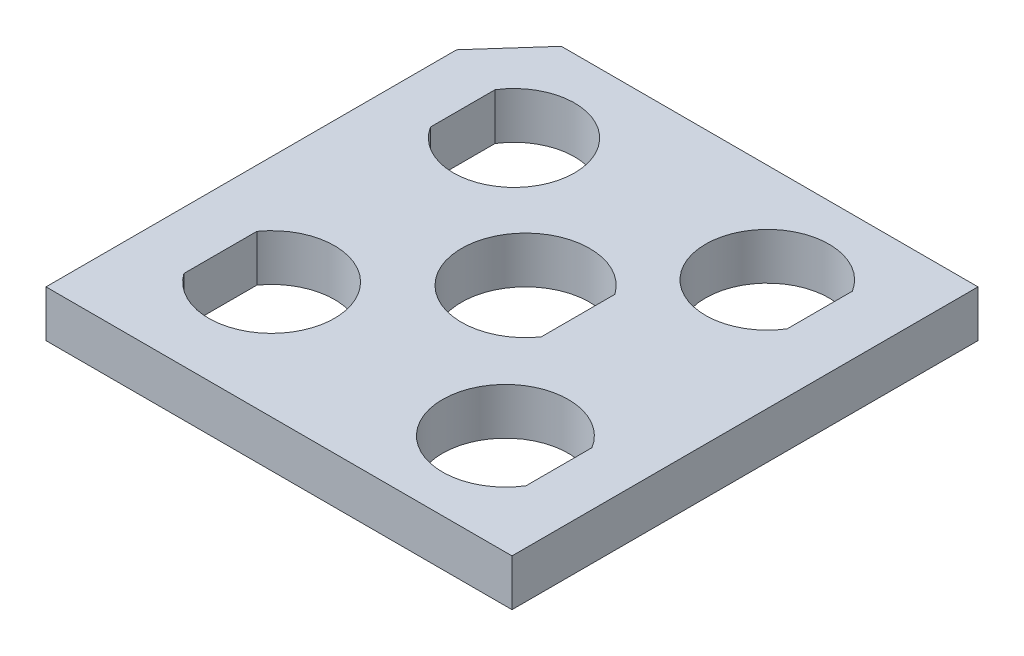
ISO-10303-21;
HEADER;
FILE_DESCRIPTION(('STEP AP214'),'2;1');
FILE_NAME('part.step','',(''),(''),'','','');
FILE_SCHEMA(('AUTOMOTIVE_DESIGN { 1 0 10303 214 1 1 1 1 }'));
ENDSEC;
DATA;
#1=APPLICATION_CONTEXT('core data for automotive mechanical design processes');
#2=APPLICATION_PROTOCOL_DEFINITION('international standard','automotive_design',2000,#1);
#3=PRODUCT_CONTEXT('',#1,'mechanical');
#4=PRODUCT('Part','Part','',(#3));
#5=PRODUCT_RELATED_PRODUCT_CATEGORY('part','',(#4));
#6=PRODUCT_DEFINITION_FORMATION('','',#4);
#7=PRODUCT_DEFINITION_CONTEXT('part definition',#1,'design');
#8=PRODUCT_DEFINITION('design','',#6,#7);
#9=PRODUCT_DEFINITION_SHAPE('','',#8);
#10=(LENGTH_UNIT() NAMED_UNIT(*) SI_UNIT(.MILLI.,.METRE.));
#11=(NAMED_UNIT(*) PLANE_ANGLE_UNIT() SI_UNIT($,.RADIAN.));
#12=(NAMED_UNIT(*) SI_UNIT($,.STERADIAN.) SOLID_ANGLE_UNIT());
#13=UNCERTAINTY_MEASURE_WITH_UNIT(LENGTH_MEASURE(1.E-05),#10,'distance_accuracy_value','');
#14=(GEOMETRIC_REPRESENTATION_CONTEXT(3) GLOBAL_UNCERTAINTY_ASSIGNED_CONTEXT((#13)) GLOBAL_UNIT_ASSIGNED_CONTEXT((#10,
#11,#12)) REPRESENTATION_CONTEXT('',''));
#15=CARTESIAN_POINT('',(0.,0.,0.));
#16=DIRECTION('',(0.,0.,1.));
#17=DIRECTION('',(1.,0.,0.));
#18=AXIS2_PLACEMENT_3D('',#15,#16,#17);
#19=CARTESIAN_POINT('',(0.,2.,0.));
#20=DIRECTION('',(0.,0.,-1.));
#21=DIRECTION('',(-1.,0.,0.));
#22=AXIS2_PLACEMENT_3D('',#19,#20,#21);
#23=PLANE('',#22);
#24=DIRECTION('',(1.,0.,0.));
#25=VECTOR('',#24,1.);
#26=CARTESIAN_POINT('',(0.,0.,0.));
#27=LINE('',#26,#25);
#28=CARTESIAN_POINT('',(0.,0.,0.));
#29=VERTEX_POINT('',#28);
#30=CARTESIAN_POINT('',(20.,0.,0.));
#31=VERTEX_POINT('',#30);
#32=EDGE_CURVE('E269',#29,#31,#27,.T.);
#33=ORIENTED_EDGE('',*,*,#32,.T.);
#34=DIRECTION('',(0.,-1.,0.));
#35=VECTOR('',#34,1.);
#36=CARTESIAN_POINT('',(20.,2.,0.));
#37=LINE('',#36,#35);
#38=CARTESIAN_POINT('',(20.,2.,0.));
#39=VERTEX_POINT('',#38);
#40=EDGE_CURVE('E51',#39,#31,#37,.T.);
#41=ORIENTED_EDGE('',*,*,#40,.F.);
#42=DIRECTION('',(1.,0.,0.));
#43=VECTOR('',#42,1.);
#44=CARTESIAN_POINT('',(0.,2.,0.));
#45=LINE('',#44,#43);
#46=CARTESIAN_POINT('',(0.,2.,0.));
#47=VERTEX_POINT('',#46);
#48=EDGE_CURVE('E270',#47,#39,#45,.T.);
#49=ORIENTED_EDGE('',*,*,#48,.F.);
#50=DIRECTION('',(0.,-1.,0.));
#51=VECTOR('',#50,1.);
#52=CARTESIAN_POINT('',(0.,2.,0.));
#53=LINE('',#52,#51);
#54=EDGE_CURVE('E285',#47,#29,#53,.T.);
#55=ORIENTED_EDGE('',*,*,#54,.T.);
#56=EDGE_LOOP('',(#33,#41,#49,#55));
#57=FACE_BOUND('',#56,.T.);
#58=ADVANCED_FACE('F43',(#57),#23,.F.);
#59=CARTESIAN_POINT('',(20.,2.,-20.));
#60=DIRECTION('',(-1.,0.,0.));
#61=DIRECTION('',(0.,0.,1.));
#62=AXIS2_PLACEMENT_3D('',#59,#60,#61);
#63=PLANE('',#62);
#64=DIRECTION('',(0.,0.,-1.));
#65=VECTOR('',#64,1.);
#66=CARTESIAN_POINT('',(20.,0.,-20.));
#67=LINE('',#66,#65);
#68=CARTESIAN_POINT('',(20.,0.,-20.));
#69=VERTEX_POINT('',#68);
#70=EDGE_CURVE('E289',#31,#69,#67,.T.);
#71=ORIENTED_EDGE('',*,*,#70,.T.);
#72=DIRECTION('',(0.,-1.,0.));
#73=VECTOR('',#72,1.);
#74=CARTESIAN_POINT('',(20.,2.,-20.));
#75=LINE('',#74,#73);
#76=CARTESIAN_POINT('',(20.,2.,-20.));
#77=VERTEX_POINT('',#76);
#78=EDGE_CURVE('E301',#77,#69,#75,.T.);
#79=ORIENTED_EDGE('',*,*,#78,.F.);
#80=DIRECTION('',(0.,0.,-1.));
#81=VECTOR('',#80,1.);
#82=CARTESIAN_POINT('',(20.,2.,-20.));
#83=LINE('',#82,#81);
#84=EDGE_CURVE('E274',#39,#77,#83,.T.);
#85=ORIENTED_EDGE('',*,*,#84,.F.);
#86=ORIENTED_EDGE('',*,*,#40,.T.);
#87=EDGE_LOOP('',(#71,#79,#85,#86));
#88=FACE_BOUND('',#87,.T.);
#89=ADVANCED_FACE('F308',(#88),#63,.F.);
#90=CARTESIAN_POINT('',(0.,2.,-20.));
#91=DIRECTION('',(0.,0.,1.));
#92=DIRECTION('',(1.,0.,0.));
#93=AXIS2_PLACEMENT_3D('',#90,#91,#92);
#94=PLANE('',#93);
#95=DIRECTION('',(-1.,0.,0.));
#96=VECTOR('',#95,1.);
#97=CARTESIAN_POINT('',(0.,0.,-20.));
#98=LINE('',#97,#96);
#99=CARTESIAN_POINT('',(2.11819946619171,0.,-20.));
#100=VERTEX_POINT('',#99);
#101=EDGE_CURVE('E292',#69,#100,#98,.T.);
#102=ORIENTED_EDGE('',*,*,#101,.T.);
#103=DIRECTION('',(0.,1.,0.));
#104=VECTOR('',#103,1.);
#105=CARTESIAN_POINT('',(2.1181994661917,2.,-20.));
#106=LINE('',#105,#104);
#107=CARTESIAN_POINT('',(2.1181994661917,2.,-20.));
#108=VERTEX_POINT('',#107);
#109=EDGE_CURVE('E265',#100,#108,#106,.T.);
#110=ORIENTED_EDGE('',*,*,#109,.T.);
#111=DIRECTION('',(-1.,0.,0.));
#112=VECTOR('',#111,1.);
#113=CARTESIAN_POINT('',(0.,2.,-20.));
#114=LINE('',#113,#112);
#115=EDGE_CURVE('E278',#77,#108,#114,.T.);
#116=ORIENTED_EDGE('',*,*,#115,.F.);
#117=ORIENTED_EDGE('',*,*,#78,.T.);
#118=EDGE_LOOP('',(#102,#110,#116,#117));
#119=FACE_BOUND('',#118,.T.);
#120=ADVANCED_FACE('F321',(#119),#94,.F.);
#121=CARTESIAN_POINT('',(0.,2.,0.));
#122=DIRECTION('',(1.,0.,0.));
#123=DIRECTION('',(0.,0.,-1.));
#124=AXIS2_PLACEMENT_3D('',#121,#122,#123);
#125=PLANE('',#124);
#126=DIRECTION('',(0.,0.,1.));
#127=VECTOR('',#126,1.);
#128=CARTESIAN_POINT('',(0.,2.,0.));
#129=LINE('',#128,#127);
#130=CARTESIAN_POINT('',(0.,2.,-17.6223947860638));
#131=VERTEX_POINT('',#130);
#132=EDGE_CURVE('E282',#131,#47,#129,.T.);
#133=ORIENTED_EDGE('',*,*,#132,.F.);
#134=DIRECTION('',(0.,-1.,0.));
#135=VECTOR('',#134,1.);
#136=CARTESIAN_POINT('',(0.,2.,-17.6223947860638));
#137=LINE('',#136,#135);
#138=CARTESIAN_POINT('',(0.,0.,-17.6223947860638));
#139=VERTEX_POINT('',#138);
#140=EDGE_CURVE('E258',#131,#139,#137,.T.);
#141=ORIENTED_EDGE('',*,*,#140,.T.);
#142=DIRECTION('',(0.,0.,1.));
#143=VECTOR('',#142,1.);
#144=CARTESIAN_POINT('',(0.,0.,0.));
#145=LINE('',#144,#143);
#146=EDGE_CURVE('E275',#139,#29,#145,.T.);
#147=ORIENTED_EDGE('',*,*,#146,.T.);
#148=ORIENTED_EDGE('',*,*,#54,.F.);
#149=EDGE_LOOP('',(#133,#141,#147,#148));
#150=FACE_BOUND('',#149,.T.);
#151=ADVANCED_FACE('F327',(#150),#125,.F.);
#152=CARTESIAN_POINT('',(0.,2.,0.));
#153=DIRECTION('',(0.,-1.,0.));
#154=DIRECTION('',(0.,0.,-1.));
#155=AXIS2_PLACEMENT_3D('',#152,#153,#154);
#156=PLANE('',#155);
#157=DIRECTION('',(0.,0.,-1.));
#158=VECTOR('',#157,1.);
#159=CARTESIAN_POINT('',(12.4861029370701,2.,-11.9279963013426));
#160=LINE('',#159,#158);
#161=CARTESIAN_POINT('',(12.4861029370701,2.,-8.76571864117421));
#162=VERTEX_POINT('',#161);
#163=CARTESIAN_POINT('',(12.4861029370701,2.,-11.9279963013426));
#164=VERTEX_POINT('',#163);
#165=EDGE_CURVE('E186',#162,#164,#160,.T.);
#166=ORIENTED_EDGE('',*,*,#165,.F.);
#167=CARTESIAN_POINT('',(10.2361029370701,2.,-10.3468574712584));
#168=DIRECTION('',(0.,1.,0.));
#169=DIRECTION('',(0.,0.,1.));
#170=AXIS2_PLACEMENT_3D('',#167,#168,#169);
#171=CIRCLE('',#170,2.75);
#172=EDGE_CURVE('E58',#164,#162,#171,.T.);
#173=ORIENTED_EDGE('',*,*,#172,.F.);
#174=EDGE_LOOP('',(#166,#173));
#175=FACE_BOUND('',#174,.T.);
#176=DIRECTION('',(0.,0.,1.));
#177=VECTOR('',#176,1.);
#178=CARTESIAN_POINT('',(2.46166722090004,2.,-3.45597393724215));
#179=LINE('',#178,#177);
#180=CARTESIAN_POINT('',(2.46166722090004,2.,-6.58646910574189));
#181=VERTEX_POINT('',#180);
#182=CARTESIAN_POINT('',(2.46166722090004,2.,-3.45597393724215));
#183=VERTEX_POINT('',#182);
#184=EDGE_CURVE('E159',#181,#183,#179,.T.);
#185=ORIENTED_EDGE('',*,*,#184,.F.);
#186=CARTESIAN_POINT('',(4.66166722090002,2.,-5.02122152149202));
#187=DIRECTION('',(0.,1.,0.));
#188=DIRECTION('',(0.,0.,1.));
#189=AXIS2_PLACEMENT_3D('',#186,#187,#188);
#190=CIRCLE('',#189,2.7);
#191=EDGE_CURVE('E66',#183,#181,#190,.T.);
#192=ORIENTED_EDGE('',*,*,#191,.F.);
#193=EDGE_LOOP('',(#185,#192));
#194=FACE_BOUND('',#193,.T.);
#195=DIRECTION('',(0.,0.,1.));
#196=VECTOR('',#195,1.);
#197=CARTESIAN_POINT('',(2.30929495883291,2.,-16.9626943989844));
#198=LINE('',#197,#196);
#199=CARTESIAN_POINT('',(2.30929495883291,2.,-16.9626943989844));
#200=VERTEX_POINT('',#199);
#201=CARTESIAN_POINT('',(2.30929495883291,2.,-14.1914131068742));
#202=VERTEX_POINT('',#201);
#203=EDGE_CURVE('E227',#200,#202,#198,.T.);
#204=ORIENTED_EDGE('',*,*,#203,.F.);
#205=CARTESIAN_POINT('',(4.5092949588329,2.,-15.5770537529293));
#206=DIRECTION('',(0.,1.,0.));
#207=DIRECTION('',(0.,0.,1.));
#208=AXIS2_PLACEMENT_3D('',#205,#206,#207);
#209=CIRCLE('',#208,2.6);
#210=EDGE_CURVE('E207',#202,#200,#209,.T.);
#211=ORIENTED_EDGE('',*,*,#210,.F.);
#212=EDGE_LOOP('',(#204,#211));
#213=FACE_BOUND('',#212,.T.);
#214=DIRECTION('',(0.,0.,-1.));
#215=VECTOR('',#214,1.);
#216=CARTESIAN_POINT('',(17.693873019264,2.,-5.73826861285755));
#217=LINE('',#216,#215);
#218=CARTESIAN_POINT('',(17.693873019264,2.,-2.90984148811137));
#219=VERTEX_POINT('',#218);
#220=CARTESIAN_POINT('',(17.693873019264,2.,-5.73826861285755));
#221=VERTEX_POINT('',#220);
#222=EDGE_CURVE('E208',#219,#221,#217,.T.);
#223=ORIENTED_EDGE('',*,*,#222,.F.);
#224=CARTESIAN_POINT('',(15.393873019264,2.,-4.32405505048446));
#225=DIRECTION('',(0.,1.,0.));
#226=DIRECTION('',(0.,0.,1.));
#227=AXIS2_PLACEMENT_3D('',#224,#225,#226);
#228=CIRCLE('',#227,2.7);
#229=EDGE_CURVE('E212',#221,#219,#228,.T.);
#230=ORIENTED_EDGE('',*,*,#229,.F.);
#231=EDGE_LOOP('',(#223,#230));
#232=FACE_BOUND('',#231,.T.);
#233=DIRECTION('',(0.,0.,-1.));
#234=VECTOR('',#233,1.);
#235=CARTESIAN_POINT('',(17.4651382805834,2.,-14.3413794068401));
#236=LINE('',#235,#234);
#237=CARTESIAN_POINT('',(17.4651382805834,2.,-14.3413794068401));
#238=VERTEX_POINT('',#237);
#239=CARTESIAN_POINT('',(17.4651382805834,2.,-17.1413794068401));
#240=VERTEX_POINT('',#239);
#241=EDGE_CURVE('E245',#238,#240,#236,.T.);
#242=ORIENTED_EDGE('',*,*,#241,.F.);
#243=CARTESIAN_POINT('',(15.2151382805834,2.,-15.7413794068401));
#244=DIRECTION('',(0.,1.,0.));
#245=DIRECTION('',(0.,0.,1.));
#246=AXIS2_PLACEMENT_3D('',#243,#244,#245);
#247=CIRCLE('',#246,2.65000000000004);
#248=EDGE_CURVE('E216',#240,#238,#247,.T.);
#249=ORIENTED_EDGE('',*,*,#248,.F.);
#250=EDGE_LOOP('',(#242,#249));
#251=FACE_BOUND('',#250,.T.);
#252=ORIENTED_EDGE('',*,*,#115,.T.);
#253=DIRECTION('',(0.665200678881918,0.,-0.746664621376315));
#254=VECTOR('',#253,1.);
#255=CARTESIAN_POINT('',(3.12502159185943,2.,-21.1301228112373));
#256=LINE('',#255,#254);
#257=EDGE_CURVE('E185',#131,#108,#256,.T.);
#258=ORIENTED_EDGE('',*,*,#257,.F.);
#259=ORIENTED_EDGE('',*,*,#132,.T.);
#260=ORIENTED_EDGE('',*,*,#48,.T.);
#261=ORIENTED_EDGE('',*,*,#84,.T.);
#262=EDGE_LOOP('',(#252,#258,#259,#260,#261));
#263=FACE_BOUND('',#262,.T.);
#264=ADVANCED_FACE('F164',(#175,#194,#213,#232,#251,#263),#156,.F.);
#265=CARTESIAN_POINT('',(0.,0.,0.));
#266=DIRECTION('',(0.,-1.,0.));
#267=DIRECTION('',(0.,0.,-1.));
#268=AXIS2_PLACEMENT_3D('',#265,#266,#267);
#269=PLANE('',#268);
#270=CARTESIAN_POINT('',(10.2361029370701,0.,-10.3468574712584));
#271=DIRECTION('',(0.,1.,0.));
#272=DIRECTION('',(0.,0.,1.));
#273=AXIS2_PLACEMENT_3D('',#270,#271,#272);
#274=CIRCLE('',#273,2.75);
#275=CARTESIAN_POINT('',(12.4861029370701,0.,-11.9279963013426));
#276=VERTEX_POINT('',#275);
#277=CARTESIAN_POINT('',(12.4861029370701,0.,-8.76571864117421));
#278=VERTEX_POINT('',#277);
#279=EDGE_CURVE('E190',#276,#278,#274,.T.);
#280=ORIENTED_EDGE('',*,*,#279,.T.);
#281=DIRECTION('',(0.,0.,-1.));
#282=VECTOR('',#281,1.);
#283=CARTESIAN_POINT('',(12.4861029370701,0.,-11.9279963013426));
#284=LINE('',#283,#282);
#285=EDGE_CURVE('E181',#278,#276,#284,.T.);
#286=ORIENTED_EDGE('',*,*,#285,.T.);
#287=EDGE_LOOP('',(#280,#286));
#288=FACE_BOUND('',#287,.T.);
#289=CARTESIAN_POINT('',(4.66166722090002,0.,-5.02122152149202));
#290=DIRECTION('',(0.,1.,0.));
#291=DIRECTION('',(0.,0.,1.));
#292=AXIS2_PLACEMENT_3D('',#289,#290,#291);
#293=CIRCLE('',#292,2.7);
#294=CARTESIAN_POINT('',(2.46166722090004,0.,-3.45597393724215));
#295=VERTEX_POINT('',#294);
#296=CARTESIAN_POINT('',(2.46166722090004,0.,-6.58646910574189));
#297=VERTEX_POINT('',#296);
#298=EDGE_CURVE('E151',#295,#297,#293,.T.);
#299=ORIENTED_EDGE('',*,*,#298,.T.);
#300=DIRECTION('',(0.,0.,1.));
#301=VECTOR('',#300,1.);
#302=CARTESIAN_POINT('',(2.46166722090004,0.,-3.45597393724215));
#303=LINE('',#302,#301);
#304=EDGE_CURVE('E173',#297,#295,#303,.T.);
#305=ORIENTED_EDGE('',*,*,#304,.T.);
#306=EDGE_LOOP('',(#299,#305));
#307=FACE_BOUND('',#306,.T.);
#308=CARTESIAN_POINT('',(4.5092949588329,0.,-15.5770537529293));
#309=DIRECTION('',(0.,1.,0.));
#310=DIRECTION('',(0.,0.,1.));
#311=AXIS2_PLACEMENT_3D('',#308,#309,#310);
#312=CIRCLE('',#311,2.6);
#313=CARTESIAN_POINT('',(2.30929495883291,0.,-14.1914131068742));
#314=VERTEX_POINT('',#313);
#315=CARTESIAN_POINT('',(2.30929495883291,0.,-16.9626943989844));
#316=VERTEX_POINT('',#315);
#317=EDGE_CURVE('E231',#314,#316,#312,.T.);
#318=ORIENTED_EDGE('',*,*,#317,.T.);
#319=DIRECTION('',(0.,0.,1.));
#320=VECTOR('',#319,1.);
#321=CARTESIAN_POINT('',(2.30929495883291,0.,-16.9626943989844));
#322=LINE('',#321,#320);
#323=EDGE_CURVE('E225',#316,#314,#322,.T.);
#324=ORIENTED_EDGE('',*,*,#323,.T.);
#325=EDGE_LOOP('',(#318,#324));
#326=FACE_BOUND('',#325,.T.);
#327=CARTESIAN_POINT('',(15.393873019264,0.,-4.32405505048446));
#328=DIRECTION('',(0.,1.,0.));
#329=DIRECTION('',(0.,0.,1.));
#330=AXIS2_PLACEMENT_3D('',#327,#328,#329);
#331=CIRCLE('',#330,2.7);
#332=CARTESIAN_POINT('',(17.693873019264,0.,-5.73826861285755));
#333=VERTEX_POINT('',#332);
#334=CARTESIAN_POINT('',(17.693873019264,0.,-2.90984148811137));
#335=VERTEX_POINT('',#334);
#336=EDGE_CURVE('E213',#333,#335,#331,.T.);
#337=ORIENTED_EDGE('',*,*,#336,.T.);
#338=DIRECTION('',(0.,0.,-1.));
#339=VECTOR('',#338,1.);
#340=CARTESIAN_POINT('',(17.693873019264,0.,-5.73826861285755));
#341=LINE('',#340,#339);
#342=EDGE_CURVE('E203',#335,#333,#341,.T.);
#343=ORIENTED_EDGE('',*,*,#342,.T.);
#344=EDGE_LOOP('',(#337,#343));
#345=FACE_BOUND('',#344,.T.);
#346=DIRECTION('',(-0.665200678881918,0.,0.746664621376315));
#347=VECTOR('',#346,1.);
#348=CARTESIAN_POINT('',(-8.75272299238952,0.,-7.79776771245797));
#349=LINE('',#348,#347);
#350=EDGE_CURVE('E11',#100,#139,#349,.T.);
#351=ORIENTED_EDGE('',*,*,#350,.F.);
#352=ORIENTED_EDGE('',*,*,#101,.F.);
#353=ORIENTED_EDGE('',*,*,#70,.F.);
#354=ORIENTED_EDGE('',*,*,#32,.F.);
#355=ORIENTED_EDGE('',*,*,#146,.F.);
#356=EDGE_LOOP('',(#351,#352,#353,#354,#355));
#357=FACE_BOUND('',#356,.T.);
#358=CARTESIAN_POINT('',(15.2151382805834,0.,-15.7413794068401));
#359=DIRECTION('',(0.,1.,0.));
#360=DIRECTION('',(0.,0.,1.));
#361=AXIS2_PLACEMENT_3D('',#358,#359,#360);
#362=CIRCLE('',#361,2.65000000000004);
#363=CARTESIAN_POINT('',(17.4651382805834,0.,-17.1413794068401));
#364=VERTEX_POINT('',#363);
#365=CARTESIAN_POINT('',(17.4651382805834,0.,-14.3413794068401));
#366=VERTEX_POINT('',#365);
#367=EDGE_CURVE('E240',#364,#366,#362,.T.);
#368=ORIENTED_EDGE('',*,*,#367,.T.);
#369=DIRECTION('',(0.,0.,-1.));
#370=VECTOR('',#369,1.);
#371=CARTESIAN_POINT('',(17.4651382805834,0.,-14.3413794068401));
#372=LINE('',#371,#370);
#373=EDGE_CURVE('E244',#366,#364,#372,.T.);
#374=ORIENTED_EDGE('',*,*,#373,.T.);
#375=EDGE_LOOP('',(#368,#374));
#376=FACE_BOUND('',#375,.T.);
#377=ADVANCED_FACE('F317',(#288,#307,#326,#345,#357,#376),#269,.T.);
#378=CARTESIAN_POINT('',(15.2151382805834,0.,-15.7413794068401));
#379=DIRECTION('',(0.,1.,0.));
#380=DIRECTION('',(0.,0.,1.));
#381=AXIS2_PLACEMENT_3D('',#378,#379,#380);
#382=CYLINDRICAL_SURFACE('',#381,2.65000000000004);
#383=ORIENTED_EDGE('',*,*,#248,.T.);
#384=DIRECTION('',(0.,1.,0.));
#385=VECTOR('',#384,1.);
#386=CARTESIAN_POINT('',(17.4651382805834,0.,-14.3413794068401));
#387=LINE('',#386,#385);
#388=EDGE_CURVE('E249',#366,#238,#387,.T.);
#389=ORIENTED_EDGE('',*,*,#388,.F.);
#390=ORIENTED_EDGE('',*,*,#367,.F.);
#391=DIRECTION('',(0.,1.,0.));
#392=VECTOR('',#391,1.);
#393=CARTESIAN_POINT('',(17.4651382805834,0.,-17.1413794068401));
#394=LINE('',#393,#392);
#395=EDGE_CURVE('E255',#364,#240,#394,.T.);
#396=ORIENTED_EDGE('',*,*,#395,.T.);
#397=EDGE_LOOP('',(#383,#389,#390,#396));
#398=FACE_BOUND('',#397,.T.);
#399=ADVANCED_FACE('F345',(#398),#382,.F.);
#400=CARTESIAN_POINT('',(17.4651382805834,0.,-14.3413794068401));
#401=DIRECTION('',(1.,0.,0.));
#402=DIRECTION('',(0.,0.,-1.));
#403=AXIS2_PLACEMENT_3D('',#400,#401,#402);
#404=PLANE('',#403);
#405=ORIENTED_EDGE('',*,*,#241,.T.);
#406=ORIENTED_EDGE('',*,*,#395,.F.);
#407=ORIENTED_EDGE('',*,*,#373,.F.);
#408=ORIENTED_EDGE('',*,*,#388,.T.);
#409=EDGE_LOOP('',(#405,#406,#407,#408));
#410=FACE_BOUND('',#409,.T.);
#411=ADVANCED_FACE('F336',(#410),#404,.F.);
#412=CARTESIAN_POINT('',(3.12502159185943,0.,-21.1301228112373));
#413=DIRECTION('',(0.746664621376315,0.,0.665200678881918));
#414=DIRECTION('',(0.665200678881918,0.,-0.746664621376315));
#415=AXIS2_PLACEMENT_3D('',#412,#413,#414);
#416=PLANE('',#415);
#417=ORIENTED_EDGE('',*,*,#350,.T.);
#418=ORIENTED_EDGE('',*,*,#140,.F.);
#419=ORIENTED_EDGE('',*,*,#257,.T.);
#420=ORIENTED_EDGE('',*,*,#109,.F.);
#421=EDGE_LOOP('',(#417,#418,#419,#420));
#422=FACE_BOUND('',#421,.T.);
#423=ADVANCED_FACE('F329',(#422),#416,.F.);
#424=CARTESIAN_POINT('',(15.393873019264,0.,-4.32405505048446));
#425=DIRECTION('',(0.,1.,0.));
#426=DIRECTION('',(0.,0.,1.));
#427=AXIS2_PLACEMENT_3D('',#424,#425,#426);
#428=CYLINDRICAL_SURFACE('',#427,2.7);
#429=ORIENTED_EDGE('',*,*,#229,.T.);
#430=DIRECTION('',(0.,1.,0.));
#431=VECTOR('',#430,1.);
#432=CARTESIAN_POINT('',(17.693873019264,0.,-2.90984148811137));
#433=LINE('',#432,#431);
#434=EDGE_CURVE('E199',#335,#219,#433,.T.);
#435=ORIENTED_EDGE('',*,*,#434,.F.);
#436=ORIENTED_EDGE('',*,*,#336,.F.);
#437=DIRECTION('',(0.,1.,0.));
#438=VECTOR('',#437,1.);
#439=CARTESIAN_POINT('',(17.693873019264,0.,-5.73826861285755));
#440=LINE('',#439,#438);
#441=EDGE_CURVE('E204',#333,#221,#440,.T.);
#442=ORIENTED_EDGE('',*,*,#441,.T.);
#443=EDGE_LOOP('',(#429,#435,#436,#442));
#444=FACE_BOUND('',#443,.T.);
#445=ADVANCED_FACE('F335',(#444),#428,.F.);
#446=CARTESIAN_POINT('',(17.693873019264,0.,-5.73826861285755));
#447=DIRECTION('',(1.,0.,0.));
#448=DIRECTION('',(0.,0.,-1.));
#449=AXIS2_PLACEMENT_3D('',#446,#447,#448);
#450=PLANE('',#449);
#451=ORIENTED_EDGE('',*,*,#222,.T.);
#452=ORIENTED_EDGE('',*,*,#441,.F.);
#453=ORIENTED_EDGE('',*,*,#342,.F.);
#454=ORIENTED_EDGE('',*,*,#434,.T.);
#455=EDGE_LOOP('',(#451,#452,#453,#454));
#456=FACE_BOUND('',#455,.T.);
#457=ADVANCED_FACE('F342',(#456),#450,.F.);
#458=CARTESIAN_POINT('',(4.5092949588329,0.,-15.5770537529293));
#459=DIRECTION('',(0.,1.,0.));
#460=DIRECTION('',(0.,0.,1.));
#461=AXIS2_PLACEMENT_3D('',#458,#459,#460);
#462=CYLINDRICAL_SURFACE('',#461,2.6);
#463=ORIENTED_EDGE('',*,*,#210,.T.);
#464=DIRECTION('',(0.,1.,0.));
#465=VECTOR('',#464,1.);
#466=CARTESIAN_POINT('',(2.30929495883291,0.,-16.9626943989844));
#467=LINE('',#466,#465);
#468=EDGE_CURVE('E170',#316,#200,#467,.T.);
#469=ORIENTED_EDGE('',*,*,#468,.F.);
#470=ORIENTED_EDGE('',*,*,#317,.F.);
#471=DIRECTION('',(0.,1.,0.));
#472=VECTOR('',#471,1.);
#473=CARTESIAN_POINT('',(2.30929495883291,0.,-14.1914131068742));
#474=LINE('',#473,#472);
#475=EDGE_CURVE('E167',#314,#202,#474,.T.);
#476=ORIENTED_EDGE('',*,*,#475,.T.);
#477=EDGE_LOOP('',(#463,#469,#470,#476));
#478=FACE_BOUND('',#477,.T.);
#479=ADVANCED_FACE('F372',(#478),#462,.F.);
#480=CARTESIAN_POINT('',(2.30929495883291,0.,-16.9626943989844));
#481=DIRECTION('',(-1.,0.,0.));
#482=DIRECTION('',(0.,0.,1.));
#483=AXIS2_PLACEMENT_3D('',#480,#481,#482);
#484=PLANE('',#483);
#485=ORIENTED_EDGE('',*,*,#203,.T.);
#486=ORIENTED_EDGE('',*,*,#475,.F.);
#487=ORIENTED_EDGE('',*,*,#323,.F.);
#488=ORIENTED_EDGE('',*,*,#468,.T.);
#489=EDGE_LOOP('',(#485,#486,#487,#488));
#490=FACE_BOUND('',#489,.T.);
#491=ADVANCED_FACE('F369',(#490),#484,.F.);
#492=CARTESIAN_POINT('',(4.66166722090002,0.,-5.02122152149202));
#493=DIRECTION('',(0.,1.,0.));
#494=DIRECTION('',(0.,0.,1.));
#495=AXIS2_PLACEMENT_3D('',#492,#493,#494);
#496=CYLINDRICAL_SURFACE('',#495,2.7);
#497=ORIENTED_EDGE('',*,*,#191,.T.);
#498=DIRECTION('',(0.,1.,0.));
#499=VECTOR('',#498,1.);
#500=CARTESIAN_POINT('',(2.46166722090004,0.,-6.58646910574189));
#501=LINE('',#500,#499);
#502=EDGE_CURVE('E156',#297,#181,#501,.T.);
#503=ORIENTED_EDGE('',*,*,#502,.F.);
#504=ORIENTED_EDGE('',*,*,#298,.F.);
#505=DIRECTION('',(0.,1.,0.));
#506=VECTOR('',#505,1.);
#507=CARTESIAN_POINT('',(2.46166722090004,0.,-3.45597393724215));
#508=LINE('',#507,#506);
#509=EDGE_CURVE('E147',#295,#183,#508,.T.);
#510=ORIENTED_EDGE('',*,*,#509,.T.);
#511=EDGE_LOOP('',(#497,#503,#504,#510));
#512=FACE_BOUND('',#511,.T.);
#513=ADVANCED_FACE('F149',(#512),#496,.F.);
#514=CARTESIAN_POINT('',(2.46166722090004,0.,-3.45597393724215));
#515=DIRECTION('',(-1.,0.,0.));
#516=DIRECTION('',(0.,0.,1.));
#517=AXIS2_PLACEMENT_3D('',#514,#515,#516);
#518=PLANE('',#517);
#519=ORIENTED_EDGE('',*,*,#184,.T.);
#520=ORIENTED_EDGE('',*,*,#509,.F.);
#521=ORIENTED_EDGE('',*,*,#304,.F.);
#522=ORIENTED_EDGE('',*,*,#502,.T.);
#523=EDGE_LOOP('',(#519,#520,#521,#522));
#524=FACE_BOUND('',#523,.T.);
#525=ADVANCED_FACE('F160',(#524),#518,.F.);
#526=CARTESIAN_POINT('',(10.2361029370701,0.,-10.3468574712584));
#527=DIRECTION('',(0.,1.,0.));
#528=DIRECTION('',(0.,0.,1.));
#529=AXIS2_PLACEMENT_3D('',#526,#527,#528);
#530=CYLINDRICAL_SURFACE('',#529,2.75);
#531=ORIENTED_EDGE('',*,*,#172,.T.);
#532=DIRECTION('',(0.,1.,0.));
#533=VECTOR('',#532,1.);
#534=CARTESIAN_POINT('',(12.4861029370701,0.,-8.76571864117421));
#535=LINE('',#534,#533);
#536=EDGE_CURVE('E178',#278,#162,#535,.T.);
#537=ORIENTED_EDGE('',*,*,#536,.F.);
#538=ORIENTED_EDGE('',*,*,#279,.F.);
#539=DIRECTION('',(0.,1.,0.));
#540=VECTOR('',#539,1.);
#541=CARTESIAN_POINT('',(12.4861029370701,0.,-11.9279963013426));
#542=LINE('',#541,#540);
#543=EDGE_CURVE('E182',#276,#164,#542,.T.);
#544=ORIENTED_EDGE('',*,*,#543,.T.);
#545=EDGE_LOOP('',(#531,#537,#538,#544));
#546=FACE_BOUND('',#545,.T.);
#547=ADVANCED_FACE('F383',(#546),#530,.F.);
#548=CARTESIAN_POINT('',(12.4861029370701,0.,-11.9279963013426));
#549=DIRECTION('',(1.,0.,0.));
#550=DIRECTION('',(0.,0.,-1.));
#551=AXIS2_PLACEMENT_3D('',#548,#549,#550);
#552=PLANE('',#551);
#553=ORIENTED_EDGE('',*,*,#165,.T.);
#554=ORIENTED_EDGE('',*,*,#543,.F.);
#555=ORIENTED_EDGE('',*,*,#285,.F.);
#556=ORIENTED_EDGE('',*,*,#536,.T.);
#557=EDGE_LOOP('',(#553,#554,#555,#556));
#558=FACE_BOUND('',#557,.T.);
#559=ADVANCED_FACE('F380',(#558),#552,.F.);
#560=CLOSED_SHELL('',(#58,#89,#120,#151,#264,#377,#399,#411,#423,#445,#457,#479,#491,#513,#525,
#547,#559));
#561=MANIFOLD_SOLID_BREP('B2',#560);
#562=ADVANCED_BREP_SHAPE_REPRESENTATION('',(#18,#561),#14);
#563=SHAPE_DEFINITION_REPRESENTATION(#9,#562);
ENDSEC;
END-ISO-10303-21;
